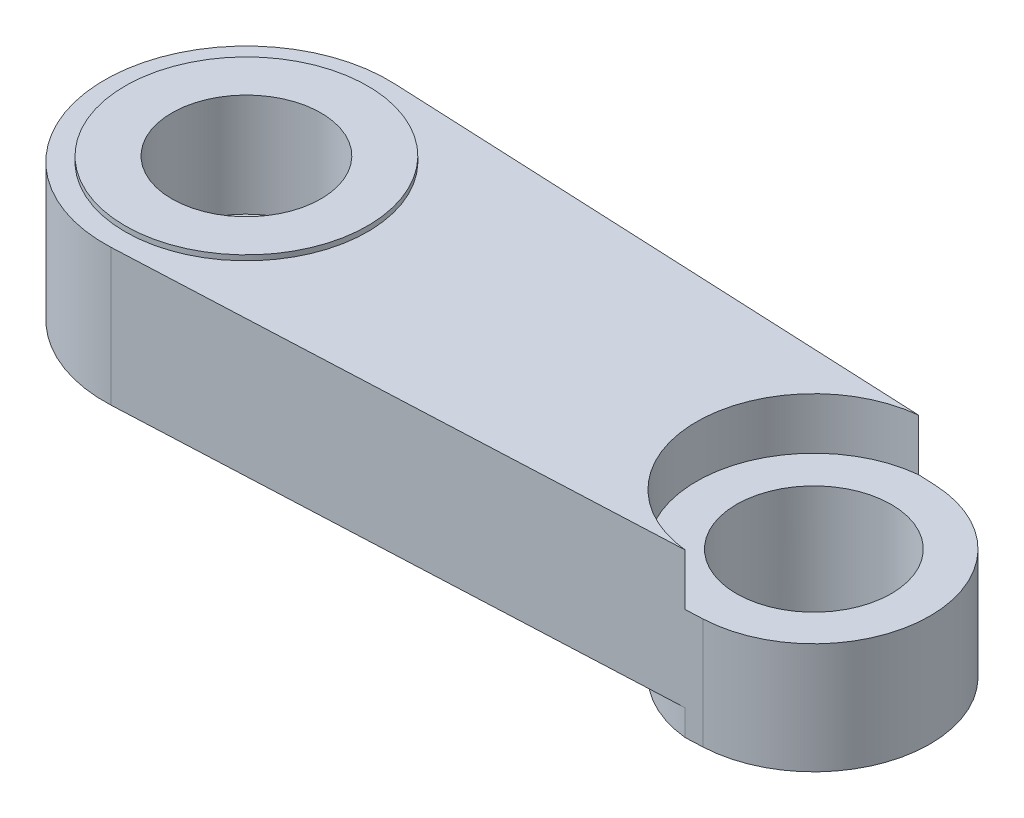
ISO-10303-21;
HEADER;
FILE_DESCRIPTION(('STEP AP214'),'2;1');
FILE_NAME('part.step','',(''),(''),'','','');
FILE_SCHEMA(('AUTOMOTIVE_DESIGN { 1 0 10303 214 1 1 1 1 }'));
ENDSEC;
DATA;
#1=APPLICATION_CONTEXT('core data for automotive mechanical design processes');
#2=APPLICATION_PROTOCOL_DEFINITION('international standard','automotive_design',2000,#1);
#3=PRODUCT_CONTEXT('',#1,'mechanical');
#4=PRODUCT('Part','Part','',(#3));
#5=PRODUCT_RELATED_PRODUCT_CATEGORY('part','',(#4));
#6=PRODUCT_DEFINITION_FORMATION('','',#4);
#7=PRODUCT_DEFINITION_CONTEXT('part definition',#1,'design');
#8=PRODUCT_DEFINITION('design','',#6,#7);
#9=PRODUCT_DEFINITION_SHAPE('','',#8);
#10=(LENGTH_UNIT() NAMED_UNIT(*) SI_UNIT(.MILLI.,.METRE.));
#11=(NAMED_UNIT(*) PLANE_ANGLE_UNIT() SI_UNIT($,.RADIAN.));
#12=(NAMED_UNIT(*) SI_UNIT($,.STERADIAN.) SOLID_ANGLE_UNIT());
#13=UNCERTAINTY_MEASURE_WITH_UNIT(LENGTH_MEASURE(1.E-05),#10,'distance_accuracy_value','');
#14=(GEOMETRIC_REPRESENTATION_CONTEXT(3) GLOBAL_UNCERTAINTY_ASSIGNED_CONTEXT((#13)) GLOBAL_UNIT_ASSIGNED_CONTEXT((#10,
#11,#12)) REPRESENTATION_CONTEXT('',''));
#15=CARTESIAN_POINT('',(0.,0.,0.));
#16=DIRECTION('',(0.,0.,1.));
#17=DIRECTION('',(1.,0.,0.));
#18=AXIS2_PLACEMENT_3D('',#15,#16,#17);
#19=CARTESIAN_POINT('',(22.,3.5,0.));
#20=DIRECTION('',(0.,-1.,0.));
#21=DIRECTION('',(0.,0.,-1.));
#22=AXIS2_PLACEMENT_3D('',#19,#20,#21);
#23=CYLINDRICAL_SURFACE('',#22,4.5);
#24=DIRECTION('',(0.,-1.,0.));
#25=VECTOR('',#24,1.);
#26=CARTESIAN_POINT('',(22.2045454545455,3.5,-4.49534883596644));
#27=LINE('',#26,#25);
#28=CARTESIAN_POINT('',(22.2045454545455,4.3,-4.49534883596644));
#29=VERTEX_POINT('',#28);
#30=CARTESIAN_POINT('',(22.2045454545455,0.,-4.49534883596644));
#31=VERTEX_POINT('',#30);
#32=EDGE_CURVE('E12',#29,#31,#27,.T.);
#33=ORIENTED_EDGE('',*,*,#32,.F.);
#34=CARTESIAN_POINT('',(22.,4.3,0.));
#35=DIRECTION('',(0.,1.,0.));
#36=DIRECTION('',(0.,0.,1.));
#37=AXIS2_PLACEMENT_3D('',#34,#35,#36);
#38=CIRCLE('',#37,4.5);
#39=CARTESIAN_POINT('',(22.2045454545455,4.3,4.49534883596644));
#40=VERTEX_POINT('',#39);
#41=EDGE_CURVE('E162',#40,#29,#38,.T.);
#42=ORIENTED_EDGE('',*,*,#41,.F.);
#43=DIRECTION('',(0.,-1.,0.));
#44=VECTOR('',#43,1.);
#45=CARTESIAN_POINT('',(22.2045454545455,3.5,4.49534883596644));
#46=LINE('',#45,#44);
#47=CARTESIAN_POINT('',(22.2045454545455,0.,4.49534883596644));
#48=VERTEX_POINT('',#47);
#49=EDGE_CURVE('E210',#40,#48,#46,.T.);
#50=ORIENTED_EDGE('',*,*,#49,.T.);
#51=CARTESIAN_POINT('',(22.,0.,0.));
#52=DIRECTION('',(0.,-1.,0.));
#53=DIRECTION('',(0.,0.,-1.));
#54=AXIS2_PLACEMENT_3D('',#51,#52,#53);
#55=CIRCLE('',#54,4.5);
#56=EDGE_CURVE('E145',#31,#48,#55,.T.);
#57=ORIENTED_EDGE('',*,*,#56,.F.);
#58=EDGE_LOOP('',(#33,#42,#50,#57));
#59=FACE_BOUND('',#58,.T.);
#60=ADVANCED_FACE('F71',(#59),#23,.T.);
#61=CARTESIAN_POINT('',(22.,3.5,0.));
#62=DIRECTION('',(0.,-1.,0.));
#63=DIRECTION('',(0.,0.,-1.));
#64=AXIS2_PLACEMENT_3D('',#61,#62,#63);
#65=CYLINDRICAL_SURFACE('',#64,2.99999999999999);
#66=CARTESIAN_POINT('',(22.,4.3,0.));
#67=DIRECTION('',(0.,1.,0.));
#68=DIRECTION('',(0.,0.,1.));
#69=AXIS2_PLACEMENT_3D('',#66,#67,#68);
#70=CIRCLE('',#69,2.99999999999999);
#71=CARTESIAN_POINT('',(22.,4.3,2.99999999999999));
#72=VERTEX_POINT('',#71);
#73=EDGE_CURVE('E158',#72,#72,#70,.T.);
#74=ORIENTED_EDGE('',*,*,#73,.T.);
#75=EDGE_LOOP('',(#74));
#76=FACE_BOUND('',#75,.T.);
#77=CARTESIAN_POINT('',(22.,0.,0.));
#78=DIRECTION('',(0.,-1.,0.));
#79=DIRECTION('',(0.,0.,-1.));
#80=AXIS2_PLACEMENT_3D('',#77,#78,#79);
#81=CIRCLE('',#80,2.99999999999999);
#82=CARTESIAN_POINT('',(22.,0.,-2.99999999999999));
#83=VERTEX_POINT('',#82);
#84=EDGE_CURVE('E224',#83,#83,#81,.T.);
#85=ORIENTED_EDGE('',*,*,#84,.T.);
#86=EDGE_LOOP('',(#85));
#87=FACE_BOUND('',#86,.T.);
#88=ADVANCED_FACE('F229',(#76,#87),#65,.F.);
#89=CARTESIAN_POINT('',(0.,3.5,0.));
#90=DIRECTION('',(0.,-1.,0.));
#91=DIRECTION('',(0.,0.,-1.));
#92=AXIS2_PLACEMENT_3D('',#89,#90,#91);
#93=CYLINDRICAL_SURFACE('',#92,1.5);
#94=CARTESIAN_POINT('',(0.,2.5,0.));
#95=DIRECTION('',(0.,1.,0.));
#96=DIRECTION('',(0.,0.,1.));
#97=AXIS2_PLACEMENT_3D('',#94,#95,#96);
#98=CIRCLE('',#97,1.5);
#99=CARTESIAN_POINT('',(0.,2.5,1.5));
#100=VERTEX_POINT('',#99);
#101=EDGE_CURVE('E74',#100,#100,#98,.T.);
#102=ORIENTED_EDGE('',*,*,#101,.T.);
#103=EDGE_LOOP('',(#102));
#104=FACE_BOUND('',#103,.T.);
#105=CARTESIAN_POINT('',(0.,1.,0.));
#106=DIRECTION('',(0.,-1.,0.));
#107=DIRECTION('',(0.,0.,-1.));
#108=AXIS2_PLACEMENT_3D('',#105,#106,#107);
#109=CIRCLE('',#108,1.5);
#110=CARTESIAN_POINT('',(0.,1.,-1.5));
#111=VERTEX_POINT('',#110);
#112=EDGE_CURVE('E199',#111,#111,#109,.T.);
#113=ORIENTED_EDGE('',*,*,#112,.T.);
#114=EDGE_LOOP('',(#113));
#115=FACE_BOUND('',#114,.T.);
#116=ADVANCED_FACE('F246',(#104,#115),#93,.F.);
#117=CARTESIAN_POINT('',(0.25,3.5,-5.49431524395898));
#118=DIRECTION('',(0.0454545454545455,0.,-0.998966407992542));
#119=DIRECTION('',(-0.998966407992542,0.,-0.0454545454545455));
#120=AXIS2_PLACEMENT_3D('',#117,#118,#119);
#121=PLANE('',#120);
#122=DIRECTION('',(0.,-1.,0.));
#123=VECTOR('',#122,1.);
#124=CARTESIAN_POINT('',(21.5325595301061,6.3,-4.52592525425524));
#125=LINE('',#124,#123);
#126=CARTESIAN_POINT('',(21.5325595301061,6.3,-4.52592525425524));
#127=VERTEX_POINT('',#126);
#128=CARTESIAN_POINT('',(21.5325595301061,4.3,-4.52592525425524));
#129=VERTEX_POINT('',#128);
#130=EDGE_CURVE('E190',#127,#129,#125,.T.);
#131=ORIENTED_EDGE('',*,*,#130,.T.);
#132=DIRECTION('',(-0.998966407992541,0.,-0.0454545454545452));
#133=VECTOR('',#132,1.);
#134=CARTESIAN_POINT('',(22.2045454545455,4.3,-4.49534883596644));
#135=LINE('',#134,#133);
#136=EDGE_CURVE('E168',#29,#129,#135,.T.);
#137=ORIENTED_EDGE('',*,*,#136,.F.);
#138=ORIENTED_EDGE('',*,*,#32,.T.);
#139=DIRECTION('',(0.998966407992541,0.,0.0454545454545452));
#140=VECTOR('',#139,1.);
#141=CARTESIAN_POINT('',(22.2045454545455,0.,-4.49534883596644));
#142=LINE('',#141,#140);
#143=CARTESIAN_POINT('',(21.5325595301061,0.,-4.52592525425524));
#144=VERTEX_POINT('',#143);
#145=EDGE_CURVE('E135',#144,#31,#142,.T.);
#146=ORIENTED_EDGE('',*,*,#145,.F.);
#147=DIRECTION('',(0.,1.,0.));
#148=VECTOR('',#147,1.);
#149=CARTESIAN_POINT('',(21.5325595301061,0.,-4.52592525425524));
#150=LINE('',#149,#148);
#151=CARTESIAN_POINT('',(21.5325595301061,1.,-4.52592525425524));
#152=VERTEX_POINT('',#151);
#153=EDGE_CURVE('E139',#144,#152,#150,.T.);
#154=ORIENTED_EDGE('',*,*,#153,.T.);
#155=DIRECTION('',(0.998966407992541,0.,0.0454545454545454));
#156=VECTOR('',#155,1.);
#157=CARTESIAN_POINT('',(0.249999999999997,1.,-5.49431524395898));
#158=LINE('',#157,#156);
#159=CARTESIAN_POINT('',(0.249999999999997,1.,-5.49431524395898));
#160=VERTEX_POINT('',#159);
#161=EDGE_CURVE('E197',#160,#152,#158,.T.);
#162=ORIENTED_EDGE('',*,*,#161,.F.);
#163=DIRECTION('',(0.,-1.,0.));
#164=VECTOR('',#163,1.);
#165=CARTESIAN_POINT('',(0.249999999999999,3.5,-5.49431524395898));
#166=LINE('',#165,#164);
#167=CARTESIAN_POINT('',(0.249999999999999,6.3,-5.49431524395898));
#168=VERTEX_POINT('',#167);
#169=EDGE_CURVE('E79',#168,#160,#166,.T.);
#170=ORIENTED_EDGE('',*,*,#169,.F.);
#171=DIRECTION('',(-0.998966407992541,0.,-0.0454545454545455));
#172=VECTOR('',#171,1.);
#173=CARTESIAN_POINT('',(0.25,6.3,-5.49431524395898));
#174=LINE('',#173,#172);
#175=EDGE_CURVE('E184',#127,#168,#174,.T.);
#176=ORIENTED_EDGE('',*,*,#175,.F.);
#177=EDGE_LOOP('',(#131,#137,#138,#146,#154,#162,#170,#176));
#178=FACE_BOUND('',#177,.T.);
#179=ADVANCED_FACE('F137',(#178),#121,.T.);
#180=CARTESIAN_POINT('',(0.,3.5,0.));
#181=DIRECTION('',(0.,-1.,0.));
#182=DIRECTION('',(0.,0.,-1.));
#183=AXIS2_PLACEMENT_3D('',#180,#181,#182);
#184=CYLINDRICAL_SURFACE('',#183,5.5);
#185=CARTESIAN_POINT('',(0.,1.,0.));
#186=DIRECTION('',(0.,-1.,0.));
#187=DIRECTION('',(0.,0.,-1.));
#188=AXIS2_PLACEMENT_3D('',#185,#186,#187);
#189=CIRCLE('',#188,5.5);
#190=CARTESIAN_POINT('',(0.250000000000001,1.,5.49431524395898));
#191=VERTEX_POINT('',#190);
#192=EDGE_CURVE('E92',#191,#160,#189,.T.);
#193=ORIENTED_EDGE('',*,*,#192,.F.);
#194=DIRECTION('',(0.,-1.,0.));
#195=VECTOR('',#194,1.);
#196=CARTESIAN_POINT('',(0.25,3.5,5.49431524395898));
#197=LINE('',#196,#195);
#198=CARTESIAN_POINT('',(0.249999999999998,6.3,5.49431524395898));
#199=VERTEX_POINT('',#198);
#200=EDGE_CURVE('E214',#199,#191,#197,.T.);
#201=ORIENTED_EDGE('',*,*,#200,.F.);
#202=CARTESIAN_POINT('',(0.,6.3,0.));
#203=DIRECTION('',(0.,1.,0.));
#204=DIRECTION('',(0.,0.,1.));
#205=AXIS2_PLACEMENT_3D('',#202,#203,#204);
#206=CIRCLE('',#205,5.5);
#207=EDGE_CURVE('E187',#168,#199,#206,.T.);
#208=ORIENTED_EDGE('',*,*,#207,.F.);
#209=ORIENTED_EDGE('',*,*,#169,.T.);
#210=EDGE_LOOP('',(#193,#201,#208,#209));
#211=FACE_BOUND('',#210,.T.);
#212=ADVANCED_FACE('F260',(#211),#184,.T.);
#213=CARTESIAN_POINT('',(22.2045454545455,3.5,4.49534883596644));
#214=DIRECTION('',(0.0454545454545455,0.,0.998966407992542));
#215=DIRECTION('',(0.998966407992542,0.,-0.0454545454545455));
#216=AXIS2_PLACEMENT_3D('',#213,#214,#215);
#217=PLANE('',#216);
#218=DIRECTION('',(0.998966407992541,0.,-0.0454545454545453));
#219=VECTOR('',#218,1.);
#220=CARTESIAN_POINT('',(21.5325595301061,4.3,4.52592525425524));
#221=LINE('',#220,#219);
#222=CARTESIAN_POINT('',(21.5325595301061,4.3,4.52592525425524));
#223=VERTEX_POINT('',#222);
#224=EDGE_CURVE('E174',#223,#40,#221,.T.);
#225=ORIENTED_EDGE('',*,*,#224,.F.);
#226=DIRECTION('',(0.,-1.,0.));
#227=VECTOR('',#226,1.);
#228=CARTESIAN_POINT('',(21.5325595301061,6.3,4.52592525425524));
#229=LINE('',#228,#227);
#230=CARTESIAN_POINT('',(21.5325595301061,6.3,4.52592525425524));
#231=VERTEX_POINT('',#230);
#232=EDGE_CURVE('E192',#231,#223,#229,.T.);
#233=ORIENTED_EDGE('',*,*,#232,.F.);
#234=DIRECTION('',(0.998966407992541,0.,-0.0454545454545455));
#235=VECTOR('',#234,1.);
#236=CARTESIAN_POINT('',(0.25,6.3,5.49431524395898));
#237=LINE('',#236,#235);
#238=EDGE_CURVE('E179',#199,#231,#237,.T.);
#239=ORIENTED_EDGE('',*,*,#238,.F.);
#240=ORIENTED_EDGE('',*,*,#200,.T.);
#241=DIRECTION('',(-0.998966407992541,0.,0.0454545454545454));
#242=VECTOR('',#241,1.);
#243=CARTESIAN_POINT('',(22.2045454545455,1.,4.49534883596644));
#244=LINE('',#243,#242);
#245=CARTESIAN_POINT('',(21.5325595301061,1.,4.52592525425524));
#246=VERTEX_POINT('',#245);
#247=EDGE_CURVE('E194',#246,#191,#244,.T.);
#248=ORIENTED_EDGE('',*,*,#247,.F.);
#249=DIRECTION('',(0.,1.,0.));
#250=VECTOR('',#249,1.);
#251=CARTESIAN_POINT('',(21.5325595301061,0.,4.52592525425524));
#252=LINE('',#251,#250);
#253=CARTESIAN_POINT('',(21.5325595301061,0.,4.52592525425524));
#254=VERTEX_POINT('',#253);
#255=EDGE_CURVE('E159',#254,#246,#252,.T.);
#256=ORIENTED_EDGE('',*,*,#255,.F.);
#257=DIRECTION('',(-0.998966407992541,0.,0.0454545454545453));
#258=VECTOR('',#257,1.);
#259=CARTESIAN_POINT('',(22.2045454545455,0.,4.49534883596644));
#260=LINE('',#259,#258);
#261=EDGE_CURVE('E152',#48,#254,#260,.T.);
#262=ORIENTED_EDGE('',*,*,#261,.F.);
#263=ORIENTED_EDGE('',*,*,#49,.F.);
#264=EDGE_LOOP('',(#225,#233,#239,#240,#248,#256,#262,#263));
#265=FACE_BOUND('',#264,.T.);
#266=ADVANCED_FACE('F222',(#265),#217,.T.);
#267=CARTESIAN_POINT('',(0.,6.5,0.));
#268=DIRECTION('',(0.,1.,0.));
#269=DIRECTION('',(0.,0.,1.));
#270=AXIS2_PLACEMENT_3D('',#267,#268,#269);
#271=PLANE('',#270);
#272=CARTESIAN_POINT('',(0.,6.5,0.));
#273=DIRECTION('',(0.,1.,0.));
#274=DIRECTION('',(0.,0.,1.));
#275=AXIS2_PLACEMENT_3D('',#272,#273,#274);
#276=CIRCLE('',#275,4.7);
#277=CARTESIAN_POINT('',(0.,6.5,4.7));
#278=VERTEX_POINT('',#277);
#279=EDGE_CURVE('E208',#278,#278,#276,.T.);
#280=ORIENTED_EDGE('',*,*,#279,.T.);
#281=EDGE_LOOP('',(#280));
#282=FACE_BOUND('',#281,.T.);
#283=CARTESIAN_POINT('',(0.,6.5,0.));
#284=DIRECTION('',(0.,1.,0.));
#285=DIRECTION('',(0.,0.,1.));
#286=AXIS2_PLACEMENT_3D('',#283,#284,#285);
#287=CIRCLE('',#286,2.89);
#288=CARTESIAN_POINT('',(0.,6.5,2.89));
#289=VERTEX_POINT('',#288);
#290=EDGE_CURVE('E205',#289,#289,#287,.T.);
#291=ORIENTED_EDGE('',*,*,#290,.F.);
#292=EDGE_LOOP('',(#291));
#293=FACE_BOUND('',#292,.T.);
#294=ADVANCED_FACE('F264',(#282,#293),#271,.T.);
#295=CARTESIAN_POINT('',(0.,6.5,0.));
#296=DIRECTION('',(0.,-1.,0.));
#297=DIRECTION('',(0.,0.,-1.));
#298=AXIS2_PLACEMENT_3D('',#295,#296,#297);
#299=CYLINDRICAL_SURFACE('',#298,4.7);
#300=CARTESIAN_POINT('',(0.,6.3,0.));
#301=DIRECTION('',(0.,1.,0.));
#302=DIRECTION('',(0.,0.,1.));
#303=AXIS2_PLACEMENT_3D('',#300,#301,#302);
#304=CIRCLE('',#303,4.7);
#305=CARTESIAN_POINT('',(0.,6.3,4.7));
#306=VERTEX_POINT('',#305);
#307=EDGE_CURVE('E176',#306,#306,#304,.F.);
#308=ORIENTED_EDGE('',*,*,#307,.F.);
#309=EDGE_LOOP('',(#308));
#310=FACE_BOUND('',#309,.T.);
#311=ORIENTED_EDGE('',*,*,#279,.F.);
#312=EDGE_LOOP('',(#311));
#313=FACE_BOUND('',#312,.T.);
#314=ADVANCED_FACE('F256',(#310,#313),#299,.T.);
#315=CARTESIAN_POINT('',(0.,6.5,0.));
#316=DIRECTION('',(0.,-1.,0.));
#317=DIRECTION('',(0.,0.,-1.));
#318=AXIS2_PLACEMENT_3D('',#315,#316,#317);
#319=CYLINDRICAL_SURFACE('',#318,2.89);
#320=ORIENTED_EDGE('',*,*,#290,.T.);
#321=EDGE_LOOP('',(#320));
#322=FACE_BOUND('',#321,.T.);
#323=CARTESIAN_POINT('',(0.,2.5,0.));
#324=DIRECTION('',(0.,1.,0.));
#325=DIRECTION('',(0.,0.,1.));
#326=AXIS2_PLACEMENT_3D('',#323,#324,#325);
#327=CIRCLE('',#326,2.89);
#328=CARTESIAN_POINT('',(0.,2.5,2.89));
#329=VERTEX_POINT('',#328);
#330=EDGE_CURVE('E202',#329,#329,#327,.T.);
#331=ORIENTED_EDGE('',*,*,#330,.F.);
#332=EDGE_LOOP('',(#331));
#333=FACE_BOUND('',#332,.T.);
#334=ADVANCED_FACE('F273',(#322,#333),#319,.F.);
#335=CARTESIAN_POINT('',(0.,2.5,0.));
#336=DIRECTION('',(0.,1.,0.));
#337=DIRECTION('',(0.,0.,1.));
#338=AXIS2_PLACEMENT_3D('',#335,#336,#337);
#339=PLANE('',#338);
#340=ORIENTED_EDGE('',*,*,#101,.F.);
#341=EDGE_LOOP('',(#340));
#342=FACE_BOUND('',#341,.T.);
#343=ORIENTED_EDGE('',*,*,#330,.T.);
#344=EDGE_LOOP('',(#343));
#345=FACE_BOUND('',#344,.T.);
#346=ADVANCED_FACE('F278',(#342,#345),#339,.T.);
#347=CARTESIAN_POINT('',(22.,1.,0.));
#348=DIRECTION('',(0.,-1.,0.));
#349=DIRECTION('',(0.,0.,-1.));
#350=AXIS2_PLACEMENT_3D('',#347,#348,#349);
#351=PLANE('',#350);
#352=CARTESIAN_POINT('',(22.,1.,0.));
#353=DIRECTION('',(0.,-1.,0.));
#354=DIRECTION('',(0.,0.,-1.));
#355=AXIS2_PLACEMENT_3D('',#352,#353,#354);
#356=CIRCLE('',#355,4.55);
#357=EDGE_CURVE('E87',#246,#152,#356,.T.);
#358=ORIENTED_EDGE('',*,*,#357,.F.);
#359=ORIENTED_EDGE('',*,*,#247,.T.);
#360=ORIENTED_EDGE('',*,*,#192,.T.);
#361=ORIENTED_EDGE('',*,*,#161,.T.);
#362=EDGE_LOOP('',(#358,#359,#360,#361));
#363=FACE_BOUND('',#362,.T.);
#364=ORIENTED_EDGE('',*,*,#112,.F.);
#365=EDGE_LOOP('',(#364));
#366=FACE_BOUND('',#365,.T.);
#367=ADVANCED_FACE('F282',(#363,#366),#351,.T.);
#368=CARTESIAN_POINT('',(22.,6.3,0.));
#369=DIRECTION('',(0.,-1.,0.));
#370=DIRECTION('',(0.,0.,-1.));
#371=AXIS2_PLACEMENT_3D('',#368,#369,#370);
#372=CYLINDRICAL_SURFACE('',#371,4.55);
#373=ORIENTED_EDGE('',*,*,#232,.T.);
#374=CARTESIAN_POINT('',(22.,4.3,0.));
#375=DIRECTION('',(0.,1.,0.));
#376=DIRECTION('',(0.,0.,1.));
#377=AXIS2_PLACEMENT_3D('',#374,#375,#376);
#378=CIRCLE('',#377,4.55);
#379=EDGE_CURVE('E171',#129,#223,#378,.T.);
#380=ORIENTED_EDGE('',*,*,#379,.F.);
#381=ORIENTED_EDGE('',*,*,#130,.F.);
#382=CARTESIAN_POINT('',(22.,6.3,0.));
#383=DIRECTION('',(0.,1.,0.));
#384=DIRECTION('',(0.,0.,1.));
#385=AXIS2_PLACEMENT_3D('',#382,#383,#384);
#386=CIRCLE('',#385,4.55);
#387=EDGE_CURVE('E182',#231,#127,#386,.F.);
#388=ORIENTED_EDGE('',*,*,#387,.F.);
#389=EDGE_LOOP('',(#373,#380,#381,#388));
#390=FACE_BOUND('',#389,.T.);
#391=ADVANCED_FACE('F285',(#390),#372,.F.);
#392=CARTESIAN_POINT('',(0.,6.3,0.));
#393=DIRECTION('',(0.,1.,0.));
#394=DIRECTION('',(0.,0.,1.));
#395=AXIS2_PLACEMENT_3D('',#392,#393,#394);
#396=PLANE('',#395);
#397=ORIENTED_EDGE('',*,*,#307,.T.);
#398=EDGE_LOOP('',(#397));
#399=FACE_BOUND('',#398,.T.);
#400=ORIENTED_EDGE('',*,*,#238,.T.);
#401=ORIENTED_EDGE('',*,*,#387,.T.);
#402=ORIENTED_EDGE('',*,*,#175,.T.);
#403=ORIENTED_EDGE('',*,*,#207,.T.);
#404=EDGE_LOOP('',(#400,#401,#402,#403));
#405=FACE_BOUND('',#404,.T.);
#406=ADVANCED_FACE('F239',(#399,#405),#396,.T.);
#407=CARTESIAN_POINT('',(22.,4.3,0.));
#408=DIRECTION('',(0.,1.,0.));
#409=DIRECTION('',(0.,0.,1.));
#410=AXIS2_PLACEMENT_3D('',#407,#408,#409);
#411=PLANE('',#410);
#412=ORIENTED_EDGE('',*,*,#73,.F.);
#413=EDGE_LOOP('',(#412));
#414=FACE_BOUND('',#413,.T.);
#415=ORIENTED_EDGE('',*,*,#41,.T.);
#416=ORIENTED_EDGE('',*,*,#136,.T.);
#417=ORIENTED_EDGE('',*,*,#379,.T.);
#418=ORIENTED_EDGE('',*,*,#224,.T.);
#419=EDGE_LOOP('',(#415,#416,#417,#418));
#420=FACE_BOUND('',#419,.T.);
#421=ADVANCED_FACE('F231',(#414,#420),#411,.T.);
#422=CARTESIAN_POINT('',(22.,0.,0.));
#423=DIRECTION('',(0.,-1.,0.));
#424=DIRECTION('',(0.,0.,-1.));
#425=AXIS2_PLACEMENT_3D('',#422,#423,#424);
#426=PLANE('',#425);
#427=CARTESIAN_POINT('',(22.,0.,0.));
#428=DIRECTION('',(0.,-1.,0.));
#429=DIRECTION('',(0.,0.,-1.));
#430=AXIS2_PLACEMENT_3D('',#427,#428,#429);
#431=CIRCLE('',#430,4.55);
#432=EDGE_CURVE('E146',#254,#144,#431,.T.);
#433=ORIENTED_EDGE('',*,*,#432,.T.);
#434=ORIENTED_EDGE('',*,*,#145,.T.);
#435=ORIENTED_EDGE('',*,*,#56,.T.);
#436=ORIENTED_EDGE('',*,*,#261,.T.);
#437=EDGE_LOOP('',(#433,#434,#435,#436));
#438=FACE_BOUND('',#437,.T.);
#439=ORIENTED_EDGE('',*,*,#84,.F.);
#440=EDGE_LOOP('',(#439));
#441=FACE_BOUND('',#440,.T.);
#442=ADVANCED_FACE('F149',(#438,#441),#426,.T.);
#443=CARTESIAN_POINT('',(22.,0.,0.));
#444=DIRECTION('',(0.,1.,0.));
#445=DIRECTION('',(0.,0.,1.));
#446=AXIS2_PLACEMENT_3D('',#443,#444,#445);
#447=CYLINDRICAL_SURFACE('',#446,4.55);
#448=ORIENTED_EDGE('',*,*,#357,.T.);
#449=ORIENTED_EDGE('',*,*,#153,.F.);
#450=ORIENTED_EDGE('',*,*,#432,.F.);
#451=ORIENTED_EDGE('',*,*,#255,.T.);
#452=EDGE_LOOP('',(#448,#449,#450,#451));
#453=FACE_BOUND('',#452,.T.);
#454=ADVANCED_FACE('F157',(#453),#447,.T.);
#455=CLOSED_SHELL('',(#60,#88,#116,#179,#212,#266,#294,#314,#334,#346,#367,#391,#406,#421,#442,#454));
#456=MANIFOLD_SOLID_BREP('B2',#455);
#457=ADVANCED_BREP_SHAPE_REPRESENTATION('',(#18,#456),#14);
#458=SHAPE_DEFINITION_REPRESENTATION(#9,#457);
ENDSEC;
END-ISO-10303-21;
